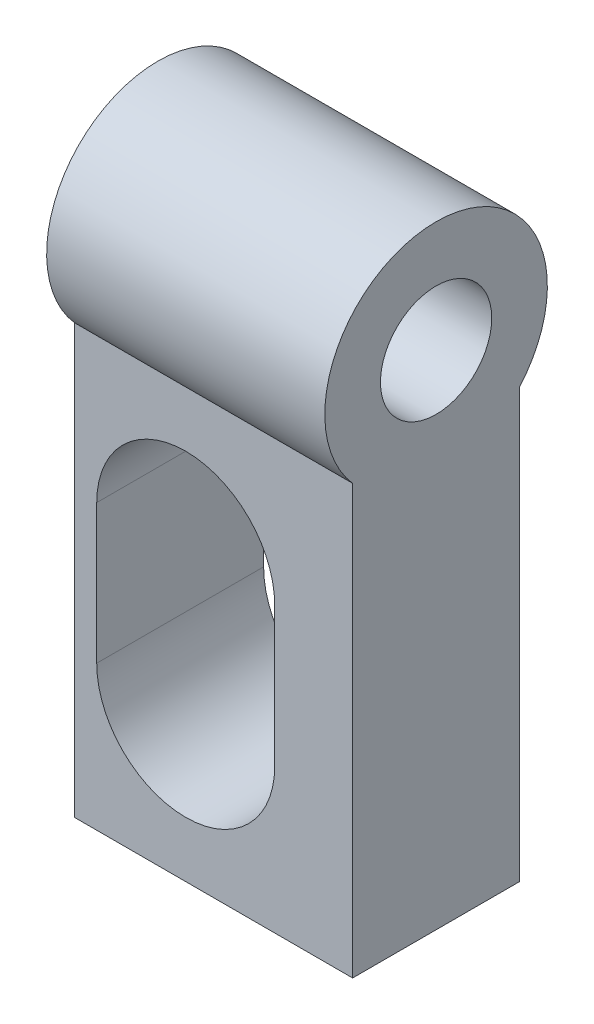
ISO-10303-21;
HEADER;
FILE_DESCRIPTION(('STEP AP214'),'2;1');
FILE_NAME('part.step','',(''),(''),'','','');
FILE_SCHEMA(('AUTOMOTIVE_DESIGN { 1 0 10303 214 1 1 1 1 }'));
ENDSEC;
DATA;
#1=APPLICATION_CONTEXT('core data for automotive mechanical design processes');
#2=APPLICATION_PROTOCOL_DEFINITION('international standard','automotive_design',2000,#1);
#3=PRODUCT_CONTEXT('',#1,'mechanical');
#4=PRODUCT('Part','Part','',(#3));
#5=PRODUCT_RELATED_PRODUCT_CATEGORY('part','',(#4));
#6=PRODUCT_DEFINITION_FORMATION('','',#4);
#7=PRODUCT_DEFINITION_CONTEXT('part definition',#1,'design');
#8=PRODUCT_DEFINITION('design','',#6,#7);
#9=PRODUCT_DEFINITION_SHAPE('','',#8);
#10=(LENGTH_UNIT() NAMED_UNIT(*) SI_UNIT(.MILLI.,.METRE.));
#11=(NAMED_UNIT(*) PLANE_ANGLE_UNIT() SI_UNIT($,.RADIAN.));
#12=(NAMED_UNIT(*) SI_UNIT($,.STERADIAN.) SOLID_ANGLE_UNIT());
#13=UNCERTAINTY_MEASURE_WITH_UNIT(LENGTH_MEASURE(1.E-05),#10,'distance_accuracy_value','');
#14=(GEOMETRIC_REPRESENTATION_CONTEXT(3) GLOBAL_UNCERTAINTY_ASSIGNED_CONTEXT((#13)) GLOBAL_UNIT_ASSIGNED_CONTEXT((#10,
#11,#12)) REPRESENTATION_CONTEXT('',''));
#15=CARTESIAN_POINT('',(0.,0.,0.));
#16=DIRECTION('',(0.,0.,1.));
#17=DIRECTION('',(1.,0.,0.));
#18=AXIS2_PLACEMENT_3D('',#15,#16,#17);
#19=CARTESIAN_POINT('',(5.,9.0228756555323,-1.5));
#20=DIRECTION('',(-1.,0.,0.));
#21=DIRECTION('',(0.,0.,1.));
#22=AXIS2_PLACEMENT_3D('',#19,#20,#21);
#23=CYLINDRICAL_SURFACE('',#22,2.);
#24=CARTESIAN_POINT('',(0.,9.0228756555323,-1.5));
#25=DIRECTION('',(1.,0.,0.));
#26=DIRECTION('',(0.,0.,-1.));
#27=AXIS2_PLACEMENT_3D('',#24,#25,#26);
#28=CIRCLE('',#27,2.);
#29=CARTESIAN_POINT('',(0.,7.7,0.));
#30=VERTEX_POINT('',#29);
#31=CARTESIAN_POINT('',(0.,7.7,-3.));
#32=VERTEX_POINT('',#31);
#33=EDGE_CURVE('E135',#30,#32,#28,.F.);
#34=ORIENTED_EDGE('',*,*,#33,.F.);
#35=DIRECTION('',(-1.,0.,0.));
#36=VECTOR('',#35,1.);
#37=CARTESIAN_POINT('',(5.,7.7,0.));
#38=LINE('',#37,#36);
#39=CARTESIAN_POINT('',(5.,7.7,0.));
#40=VERTEX_POINT('',#39);
#41=EDGE_CURVE('E11',#40,#30,#38,.T.);
#42=ORIENTED_EDGE('',*,*,#41,.F.);
#43=CARTESIAN_POINT('',(5.,9.0228756555323,-1.5));
#44=DIRECTION('',(1.,0.,0.));
#45=DIRECTION('',(0.,0.,-1.));
#46=AXIS2_PLACEMENT_3D('',#43,#44,#45);
#47=CIRCLE('',#46,2.);
#48=CARTESIAN_POINT('',(5.,7.7,-3.));
#49=VERTEX_POINT('',#48);
#50=EDGE_CURVE('E136',#40,#49,#47,.F.);
#51=ORIENTED_EDGE('',*,*,#50,.T.);
#52=DIRECTION('',(-1.,0.,0.));
#53=VECTOR('',#52,1.);
#54=CARTESIAN_POINT('',(5.,7.7,-3.));
#55=LINE('',#54,#53);
#56=EDGE_CURVE('E149',#49,#32,#55,.T.);
#57=ORIENTED_EDGE('',*,*,#56,.T.);
#58=EDGE_LOOP('',(#34,#42,#51,#57));
#59=FACE_BOUND('',#58,.T.);
#60=ADVANCED_FACE('F35',(#59),#23,.T.);
#61=CARTESIAN_POINT('',(5.,0.,0.));
#62=DIRECTION('',(0.,0.,-1.));
#63=DIRECTION('',(0.,1.,0.));
#64=AXIS2_PLACEMENT_3D('',#61,#62,#63);
#65=PLANE('',#64);
#66=DIRECTION('',(0.,1.,0.));
#67=VECTOR('',#66,1.);
#68=CARTESIAN_POINT('',(0.400000000000002,0.,0.));
#69=LINE('',#68,#67);
#70=CARTESIAN_POINT('',(0.4,2.6,0.));
#71=VERTEX_POINT('',#70);
#72=CARTESIAN_POINT('',(0.4,5.1,0.));
#73=VERTEX_POINT('',#72);
#74=EDGE_CURVE('E129',#71,#73,#69,.T.);
#75=ORIENTED_EDGE('',*,*,#74,.T.);
#76=CARTESIAN_POINT('',(2.,5.1,0.));
#77=DIRECTION('',(0.,0.,-1.));
#78=DIRECTION('',(0.,1.,0.));
#79=AXIS2_PLACEMENT_3D('',#76,#77,#78);
#80=CIRCLE('',#79,1.6);
#81=CARTESIAN_POINT('',(3.6,5.1,0.));
#82=VERTEX_POINT('',#81);
#83=EDGE_CURVE('E132',#73,#82,#80,.T.);
#84=ORIENTED_EDGE('',*,*,#83,.T.);
#85=DIRECTION('',(0.,-1.,0.));
#86=VECTOR('',#85,1.);
#87=CARTESIAN_POINT('',(3.6,0.,0.));
#88=LINE('',#87,#86);
#89=CARTESIAN_POINT('',(3.6,2.6,0.));
#90=VERTEX_POINT('',#89);
#91=EDGE_CURVE('E124',#82,#90,#88,.T.);
#92=ORIENTED_EDGE('',*,*,#91,.T.);
#93=CARTESIAN_POINT('',(2.,2.6,0.));
#94=DIRECTION('',(0.,0.,-1.));
#95=DIRECTION('',(0.,1.,0.));
#96=AXIS2_PLACEMENT_3D('',#93,#94,#95);
#97=CIRCLE('',#96,1.6);
#98=EDGE_CURVE('E104',#90,#71,#97,.T.);
#99=ORIENTED_EDGE('',*,*,#98,.T.);
#100=EDGE_LOOP('',(#75,#84,#92,#99));
#101=FACE_BOUND('',#100,.T.);
#102=DIRECTION('',(0.,-1.,0.));
#103=VECTOR('',#102,1.);
#104=CARTESIAN_POINT('',(0.,0.,0.));
#105=LINE('',#104,#103);
#106=CARTESIAN_POINT('',(0.,0.,0.));
#107=VERTEX_POINT('',#106);
#108=EDGE_CURVE('E152',#30,#107,#105,.T.);
#109=ORIENTED_EDGE('',*,*,#108,.T.);
#110=DIRECTION('',(-1.,0.,0.));
#111=VECTOR('',#110,1.);
#112=CARTESIAN_POINT('',(5.,0.,0.));
#113=LINE('',#112,#111);
#114=CARTESIAN_POINT('',(5.,0.,0.));
#115=VERTEX_POINT('',#114);
#116=EDGE_CURVE('E42',#115,#107,#113,.T.);
#117=ORIENTED_EDGE('',*,*,#116,.F.);
#118=DIRECTION('',(0.,-1.,0.));
#119=VECTOR('',#118,1.);
#120=CARTESIAN_POINT('',(5.,0.,0.));
#121=LINE('',#120,#119);
#122=EDGE_CURVE('E139',#40,#115,#121,.T.);
#123=ORIENTED_EDGE('',*,*,#122,.F.);
#124=ORIENTED_EDGE('',*,*,#41,.T.);
#125=EDGE_LOOP('',(#109,#117,#123,#124));
#126=FACE_BOUND('',#125,.T.);
#127=ADVANCED_FACE('F185',(#101,#126),#65,.F.);
#128=CARTESIAN_POINT('',(5.,0.,0.));
#129=DIRECTION('',(0.,1.,0.));
#130=DIRECTION('',(0.,0.,1.));
#131=AXIS2_PLACEMENT_3D('',#128,#129,#130);
#132=PLANE('',#131);
#133=DIRECTION('',(0.,0.,-1.));
#134=VECTOR('',#133,1.);
#135=CARTESIAN_POINT('',(0.,0.,0.));
#136=LINE('',#135,#134);
#137=CARTESIAN_POINT('',(0.,0.,-3.));
#138=VERTEX_POINT('',#137);
#139=EDGE_CURVE('E154',#107,#138,#136,.T.);
#140=ORIENTED_EDGE('',*,*,#139,.T.);
#141=DIRECTION('',(-1.,0.,0.));
#142=VECTOR('',#141,1.);
#143=CARTESIAN_POINT('',(5.,0.,-3.));
#144=LINE('',#143,#142);
#145=CARTESIAN_POINT('',(5.,0.,-3.));
#146=VERTEX_POINT('',#145);
#147=EDGE_CURVE('E162',#146,#138,#144,.T.);
#148=ORIENTED_EDGE('',*,*,#147,.F.);
#149=DIRECTION('',(0.,0.,-1.));
#150=VECTOR('',#149,1.);
#151=CARTESIAN_POINT('',(5.,0.,0.));
#152=LINE('',#151,#150);
#153=EDGE_CURVE('E142',#115,#146,#152,.T.);
#154=ORIENTED_EDGE('',*,*,#153,.F.);
#155=ORIENTED_EDGE('',*,*,#116,.T.);
#156=EDGE_LOOP('',(#140,#148,#154,#155));
#157=FACE_BOUND('',#156,.T.);
#158=ADVANCED_FACE('F169',(#157),#132,.F.);
#159=CARTESIAN_POINT('',(5.,0.,-3.));
#160=DIRECTION('',(0.,0.,1.));
#161=DIRECTION('',(1.,0.,0.));
#162=AXIS2_PLACEMENT_3D('',#159,#160,#161);
#163=PLANE('',#162);
#164=DIRECTION('',(0.,-1.,0.));
#165=VECTOR('',#164,1.);
#166=CARTESIAN_POINT('',(3.6,5.1,-3.));
#167=LINE('',#166,#165);
#168=CARTESIAN_POINT('',(3.6,5.1,-3.));
#169=VERTEX_POINT('',#168);
#170=CARTESIAN_POINT('',(3.6,2.6,-3.));
#171=VERTEX_POINT('',#170);
#172=EDGE_CURVE('E110',#169,#171,#167,.T.);
#173=ORIENTED_EDGE('',*,*,#172,.F.);
#174=CARTESIAN_POINT('',(2.,5.1,-3.));
#175=DIRECTION('',(0.,0.,-1.));
#176=DIRECTION('',(-1.,0.,0.));
#177=AXIS2_PLACEMENT_3D('',#174,#175,#176);
#178=CIRCLE('',#177,1.6);
#179=CARTESIAN_POINT('',(0.4,5.1,-3.));
#180=VERTEX_POINT('',#179);
#181=EDGE_CURVE('E57',#180,#169,#178,.T.);
#182=ORIENTED_EDGE('',*,*,#181,.F.);
#183=DIRECTION('',(0.,1.,0.));
#184=VECTOR('',#183,1.);
#185=CARTESIAN_POINT('',(0.4,5.1,-3.));
#186=LINE('',#185,#184);
#187=CARTESIAN_POINT('',(0.4,2.6,-3.));
#188=VERTEX_POINT('',#187);
#189=EDGE_CURVE('E117',#188,#180,#186,.T.);
#190=ORIENTED_EDGE('',*,*,#189,.F.);
#191=CARTESIAN_POINT('',(2.,2.6,-3.));
#192=DIRECTION('',(0.,0.,-1.));
#193=DIRECTION('',(-1.,0.,0.));
#194=AXIS2_PLACEMENT_3D('',#191,#192,#193);
#195=CIRCLE('',#194,1.6);
#196=EDGE_CURVE('E101',#171,#188,#195,.T.);
#197=ORIENTED_EDGE('',*,*,#196,.F.);
#198=EDGE_LOOP('',(#173,#182,#190,#197));
#199=FACE_BOUND('',#198,.T.);
#200=DIRECTION('',(0.,1.,0.));
#201=VECTOR('',#200,1.);
#202=CARTESIAN_POINT('',(0.,0.,-3.));
#203=LINE('',#202,#201);
#204=EDGE_CURVE('E156',#138,#32,#203,.T.);
#205=ORIENTED_EDGE('',*,*,#204,.T.);
#206=ORIENTED_EDGE('',*,*,#56,.F.);
#207=DIRECTION('',(0.,1.,0.));
#208=VECTOR('',#207,1.);
#209=CARTESIAN_POINT('',(5.,0.,-3.));
#210=LINE('',#209,#208);
#211=EDGE_CURVE('E144',#146,#49,#210,.T.);
#212=ORIENTED_EDGE('',*,*,#211,.F.);
#213=ORIENTED_EDGE('',*,*,#147,.T.);
#214=EDGE_LOOP('',(#205,#206,#212,#213));
#215=FACE_BOUND('',#214,.T.);
#216=ADVANCED_FACE('F114',(#199,#215),#163,.F.);
#217=CARTESIAN_POINT('',(5.,9.0228756555323,-1.5));
#218=DIRECTION('',(-1.,0.,0.));
#219=DIRECTION('',(0.,0.,1.));
#220=AXIS2_PLACEMENT_3D('',#217,#218,#219);
#221=CYLINDRICAL_SURFACE('',#220,1.);
#222=CARTESIAN_POINT('',(5.,9.0228756555323,-1.5));
#223=DIRECTION('',(1.,0.,0.));
#224=DIRECTION('',(0.,0.,-1.));
#225=AXIS2_PLACEMENT_3D('',#222,#223,#224);
#226=CIRCLE('',#225,1.);
#227=CARTESIAN_POINT('',(5.,9.0228756555323,-2.5));
#228=VERTEX_POINT('',#227);
#229=EDGE_CURVE('E146',#228,#228,#226,.T.);
#230=ORIENTED_EDGE('',*,*,#229,.T.);
#231=EDGE_LOOP('',(#230));
#232=FACE_BOUND('',#231,.T.);
#233=CARTESIAN_POINT('',(0.,9.0228756555323,-1.5));
#234=DIRECTION('',(1.,0.,0.));
#235=DIRECTION('',(0.,0.,-1.));
#236=AXIS2_PLACEMENT_3D('',#233,#234,#235);
#237=CIRCLE('',#236,1.);
#238=CARTESIAN_POINT('',(0.,9.0228756555323,-2.5));
#239=VERTEX_POINT('',#238);
#240=EDGE_CURVE('E140',#239,#239,#237,.T.);
#241=ORIENTED_EDGE('',*,*,#240,.F.);
#242=EDGE_LOOP('',(#241));
#243=FACE_BOUND('',#242,.T.);
#244=ADVANCED_FACE('F199',(#232,#243),#221,.F.);
#245=CARTESIAN_POINT('',(5.,0.,0.));
#246=DIRECTION('',(1.,0.,0.));
#247=DIRECTION('',(0.,0.,-1.));
#248=AXIS2_PLACEMENT_3D('',#245,#246,#247);
#249=PLANE('',#248);
#250=ORIENTED_EDGE('',*,*,#50,.F.);
#251=ORIENTED_EDGE('',*,*,#122,.T.);
#252=ORIENTED_EDGE('',*,*,#153,.T.);
#253=ORIENTED_EDGE('',*,*,#211,.T.);
#254=EDGE_LOOP('',(#250,#251,#252,#253));
#255=FACE_BOUND('',#254,.T.);
#256=ORIENTED_EDGE('',*,*,#229,.F.);
#257=EDGE_LOOP('',(#256));
#258=FACE_BOUND('',#257,.T.);
#259=ADVANCED_FACE('F183',(#255,#258),#249,.T.);
#260=CARTESIAN_POINT('',(0.,0.,0.));
#261=DIRECTION('',(1.,0.,0.));
#262=DIRECTION('',(0.,0.,-1.));
#263=AXIS2_PLACEMENT_3D('',#260,#261,#262);
#264=PLANE('',#263);
#265=ORIENTED_EDGE('',*,*,#33,.T.);
#266=ORIENTED_EDGE('',*,*,#204,.F.);
#267=ORIENTED_EDGE('',*,*,#139,.F.);
#268=ORIENTED_EDGE('',*,*,#108,.F.);
#269=EDGE_LOOP('',(#265,#266,#267,#268));
#270=FACE_BOUND('',#269,.T.);
#271=ORIENTED_EDGE('',*,*,#240,.T.);
#272=EDGE_LOOP('',(#271));
#273=FACE_BOUND('',#272,.T.);
#274=ADVANCED_FACE('F176',(#270,#273),#264,.F.);
#275=CARTESIAN_POINT('',(2.,5.1,0.5));
#276=DIRECTION('',(0.,0.,-1.));
#277=DIRECTION('',(-1.,0.,0.));
#278=AXIS2_PLACEMENT_3D('',#275,#276,#277);
#279=CYLINDRICAL_SURFACE('',#278,1.6);
#280=DIRECTION('',(0.,0.,-1.));
#281=VECTOR('',#280,1.);
#282=CARTESIAN_POINT('',(0.4,5.1,0.5));
#283=LINE('',#282,#281);
#284=EDGE_CURVE('E122',#73,#180,#283,.T.);
#285=ORIENTED_EDGE('',*,*,#284,.T.);
#286=ORIENTED_EDGE('',*,*,#181,.T.);
#287=DIRECTION('',(0.,0.,-1.));
#288=VECTOR('',#287,1.);
#289=CARTESIAN_POINT('',(3.6,5.1,0.5));
#290=LINE('',#289,#288);
#291=EDGE_CURVE('E107',#82,#169,#290,.T.);
#292=ORIENTED_EDGE('',*,*,#291,.F.);
#293=ORIENTED_EDGE('',*,*,#83,.F.);
#294=EDGE_LOOP('',(#285,#286,#292,#293));
#295=FACE_BOUND('',#294,.T.);
#296=ADVANCED_FACE('F205',(#295),#279,.F.);
#297=CARTESIAN_POINT('',(0.4,5.1,0.5));
#298=DIRECTION('',(-1.,0.,0.));
#299=DIRECTION('',(0.,-1.,0.));
#300=AXIS2_PLACEMENT_3D('',#297,#298,#299);
#301=PLANE('',#300);
#302=DIRECTION('',(0.,0.,-1.));
#303=VECTOR('',#302,1.);
#304=CARTESIAN_POINT('',(0.4,2.6,0.5));
#305=LINE('',#304,#303);
#306=EDGE_CURVE('E106',#71,#188,#305,.T.);
#307=ORIENTED_EDGE('',*,*,#306,.T.);
#308=ORIENTED_EDGE('',*,*,#189,.T.);
#309=ORIENTED_EDGE('',*,*,#284,.F.);
#310=ORIENTED_EDGE('',*,*,#74,.F.);
#311=EDGE_LOOP('',(#307,#308,#309,#310));
#312=FACE_BOUND('',#311,.T.);
#313=ADVANCED_FACE('F210',(#312),#301,.F.);
#314=CARTESIAN_POINT('',(2.,2.6,0.5));
#315=DIRECTION('',(0.,0.,-1.));
#316=DIRECTION('',(-1.,0.,0.));
#317=AXIS2_PLACEMENT_3D('',#314,#315,#316);
#318=CYLINDRICAL_SURFACE('',#317,1.6);
#319=DIRECTION('',(0.,0.,-1.));
#320=VECTOR('',#319,1.);
#321=CARTESIAN_POINT('',(3.6,2.6,0.5));
#322=LINE('',#321,#320);
#323=EDGE_CURVE('E49',#90,#171,#322,.T.);
#324=ORIENTED_EDGE('',*,*,#323,.T.);
#325=ORIENTED_EDGE('',*,*,#196,.T.);
#326=ORIENTED_EDGE('',*,*,#306,.F.);
#327=ORIENTED_EDGE('',*,*,#98,.F.);
#328=EDGE_LOOP('',(#324,#325,#326,#327));
#329=FACE_BOUND('',#328,.T.);
#330=ADVANCED_FACE('F98',(#329),#318,.F.);
#331=CARTESIAN_POINT('',(3.6,5.1,0.5));
#332=DIRECTION('',(1.,0.,0.));
#333=DIRECTION('',(0.,1.,0.));
#334=AXIS2_PLACEMENT_3D('',#331,#332,#333);
#335=PLANE('',#334);
#336=ORIENTED_EDGE('',*,*,#291,.T.);
#337=ORIENTED_EDGE('',*,*,#172,.T.);
#338=ORIENTED_EDGE('',*,*,#323,.F.);
#339=ORIENTED_EDGE('',*,*,#91,.F.);
#340=EDGE_LOOP('',(#336,#337,#338,#339));
#341=FACE_BOUND('',#340,.T.);
#342=ADVANCED_FACE('F111',(#341),#335,.F.);
#343=CLOSED_SHELL('',(#60,#127,#158,#216,#244,#259,#274,#296,#313,#330,#342));
#344=MANIFOLD_SOLID_BREP('B2',#343);
#345=ADVANCED_BREP_SHAPE_REPRESENTATION('',(#18,#344),#14);
#346=SHAPE_DEFINITION_REPRESENTATION(#9,#345);
ENDSEC;
END-ISO-10303-21;
